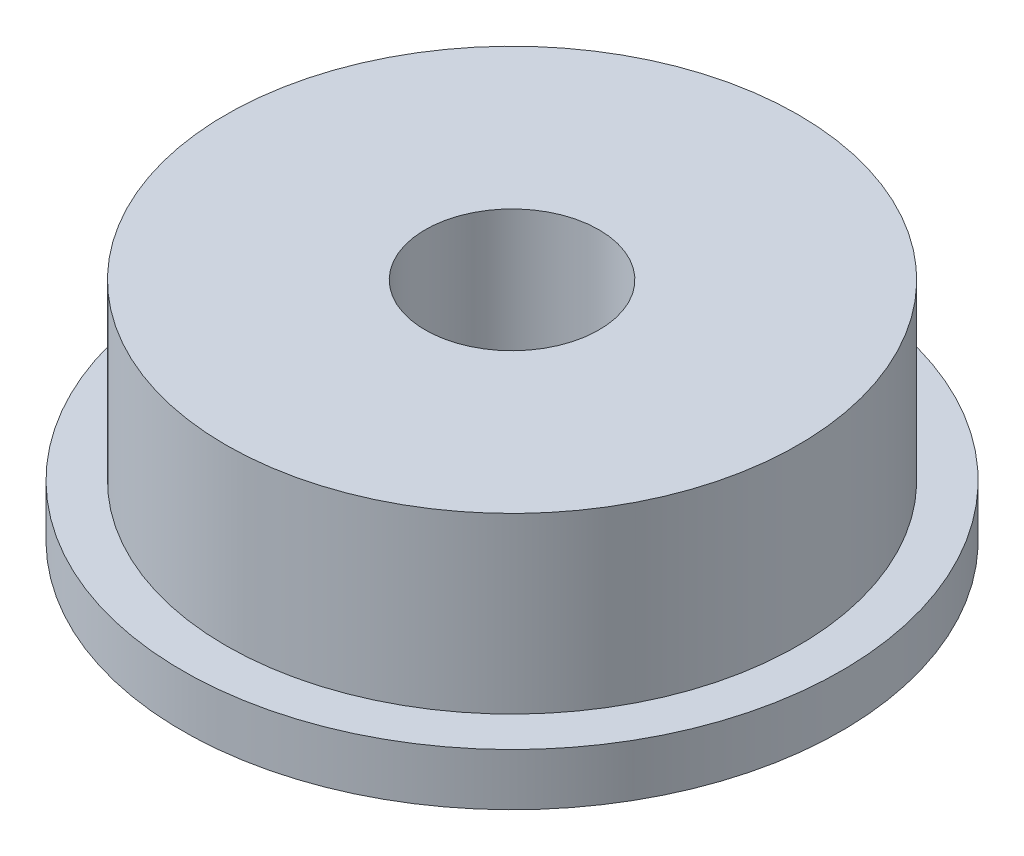
ISO-10303-21;
HEADER;
FILE_DESCRIPTION(('STEP AP214'),'2;1');
FILE_NAME('part.step','',(''),(''),'','','');
FILE_SCHEMA(('AUTOMOTIVE_DESIGN { 1 0 10303 214 1 1 1 1 }'));
ENDSEC;
DATA;
#1=APPLICATION_CONTEXT('core data for automotive mechanical design processes');
#2=APPLICATION_PROTOCOL_DEFINITION('international standard','automotive_design',2000,#1);
#3=PRODUCT_CONTEXT('',#1,'mechanical');
#4=PRODUCT('Part','Part','',(#3));
#5=PRODUCT_RELATED_PRODUCT_CATEGORY('part','',(#4));
#6=PRODUCT_DEFINITION_FORMATION('','',#4);
#7=PRODUCT_DEFINITION_CONTEXT('part definition',#1,'design');
#8=PRODUCT_DEFINITION('design','',#6,#7);
#9=PRODUCT_DEFINITION_SHAPE('','',#8);
#10=(LENGTH_UNIT() NAMED_UNIT(*) SI_UNIT(.MILLI.,.METRE.));
#11=(NAMED_UNIT(*) PLANE_ANGLE_UNIT() SI_UNIT($,.RADIAN.));
#12=(NAMED_UNIT(*) SI_UNIT($,.STERADIAN.) SOLID_ANGLE_UNIT());
#13=UNCERTAINTY_MEASURE_WITH_UNIT(LENGTH_MEASURE(1.E-05),#10,'distance_accuracy_value','');
#14=(GEOMETRIC_REPRESENTATION_CONTEXT(3) GLOBAL_UNCERTAINTY_ASSIGNED_CONTEXT((#13)) GLOBAL_UNIT_ASSIGNED_CONTEXT((#10,
#11,#12)) REPRESENTATION_CONTEXT('',''));
#15=CARTESIAN_POINT('',(0.,0.,0.));
#16=DIRECTION('',(0.,0.,1.));
#17=DIRECTION('',(1.,0.,0.));
#18=AXIS2_PLACEMENT_3D('',#15,#16,#17);
#19=CARTESIAN_POINT('',(5.69,0.,0.));
#20=DIRECTION('',(0.,-1.,0.));
#21=DIRECTION('',(0.,0.,-1.));
#22=AXIS2_PLACEMENT_3D('',#19,#20,#21);
#23=PLANE('',#22);
#24=CARTESIAN_POINT('',(0.,0.,0.));
#25=DIRECTION('',(0.,-1.,0.));
#26=DIRECTION('',(0.,0.,-1.));
#27=AXIS2_PLACEMENT_3D('',#24,#25,#26);
#28=CIRCLE('',#27,5.69);
#29=CARTESIAN_POINT('',(0.,0.,-5.69));
#30=VERTEX_POINT('',#29);
#31=EDGE_CURVE('E53',#30,#30,#28,.T.);
#32=ORIENTED_EDGE('',*,*,#31,.T.);
#33=EDGE_LOOP('',(#32));
#34=FACE_BOUND('',#33,.T.);
#35=CARTESIAN_POINT('',(0.,0.,0.));
#36=DIRECTION('',(0.,-1.,0.));
#37=DIRECTION('',(0.,0.,-1.));
#38=AXIS2_PLACEMENT_3D('',#35,#36,#37);
#39=CIRCLE('',#38,1.5);
#40=CARTESIAN_POINT('',(0.,0.,-1.5));
#41=VERTEX_POINT('',#40);
#42=EDGE_CURVE('E10',#41,#41,#39,.T.);
#43=ORIENTED_EDGE('',*,*,#42,.F.);
#44=EDGE_LOOP('',(#43));
#45=FACE_BOUND('',#44,.T.);
#46=ADVANCED_FACE('F31',(#34,#45),#23,.T.);
#47=CARTESIAN_POINT('',(0.,0.,0.));
#48=DIRECTION('',(0.,-1.,0.));
#49=DIRECTION('',(0.,0.,-1.));
#50=AXIS2_PLACEMENT_3D('',#47,#48,#49);
#51=CYLINDRICAL_SURFACE('',#50,1.5);
#52=ORIENTED_EDGE('',*,*,#42,.T.);
#53=EDGE_LOOP('',(#52));
#54=FACE_BOUND('',#53,.T.);
#55=CARTESIAN_POINT('',(0.,3.9,0.));
#56=DIRECTION('',(0.,-1.,0.));
#57=DIRECTION('',(0.,0.,-1.));
#58=AXIS2_PLACEMENT_3D('',#55,#56,#57);
#59=CIRCLE('',#58,1.5);
#60=CARTESIAN_POINT('',(0.,3.9,-1.5));
#61=VERTEX_POINT('',#60);
#62=EDGE_CURVE('E37',#61,#61,#59,.T.);
#63=ORIENTED_EDGE('',*,*,#62,.F.);
#64=EDGE_LOOP('',(#63));
#65=FACE_BOUND('',#64,.T.);
#66=ADVANCED_FACE('F71',(#54,#65),#51,.F.);
#67=CARTESIAN_POINT('',(1.5,3.9,0.));
#68=DIRECTION('',(0.,1.,0.));
#69=DIRECTION('',(0.,0.,1.));
#70=AXIS2_PLACEMENT_3D('',#67,#68,#69);
#71=PLANE('',#70);
#72=ORIENTED_EDGE('',*,*,#62,.T.);
#73=EDGE_LOOP('',(#72));
#74=FACE_BOUND('',#73,.T.);
#75=CARTESIAN_POINT('',(0.,3.9,0.));
#76=DIRECTION('',(0.,-1.,0.));
#77=DIRECTION('',(0.,0.,-1.));
#78=AXIS2_PLACEMENT_3D('',#75,#76,#77);
#79=CIRCLE('',#78,4.94);
#80=CARTESIAN_POINT('',(0.,3.9,-4.94));
#81=VERTEX_POINT('',#80);
#82=EDGE_CURVE('E41',#81,#81,#79,.T.);
#83=ORIENTED_EDGE('',*,*,#82,.F.);
#84=EDGE_LOOP('',(#83));
#85=FACE_BOUND('',#84,.T.);
#86=ADVANCED_FACE('F75',(#74,#85),#71,.T.);
#87=CARTESIAN_POINT('',(0.,0.,0.));
#88=DIRECTION('',(0.,-1.,0.));
#89=DIRECTION('',(0.,0.,-1.));
#90=AXIS2_PLACEMENT_3D('',#87,#88,#89);
#91=CYLINDRICAL_SURFACE('',#90,4.94);
#92=ORIENTED_EDGE('',*,*,#82,.T.);
#93=EDGE_LOOP('',(#92));
#94=FACE_BOUND('',#93,.T.);
#95=CARTESIAN_POINT('',(0.,0.9,0.));
#96=DIRECTION('',(0.,-1.,0.));
#97=DIRECTION('',(0.,0.,-1.));
#98=AXIS2_PLACEMENT_3D('',#95,#96,#97);
#99=CIRCLE('',#98,4.94);
#100=CARTESIAN_POINT('',(0.,0.9,-4.94));
#101=VERTEX_POINT('',#100);
#102=EDGE_CURVE('E45',#101,#101,#99,.T.);
#103=ORIENTED_EDGE('',*,*,#102,.F.);
#104=EDGE_LOOP('',(#103));
#105=FACE_BOUND('',#104,.T.);
#106=ADVANCED_FACE('F67',(#94,#105),#91,.T.);
#107=CARTESIAN_POINT('',(4.94,0.9,0.));
#108=DIRECTION('',(0.,1.,0.));
#109=DIRECTION('',(0.,0.,1.));
#110=AXIS2_PLACEMENT_3D('',#107,#108,#109);
#111=PLANE('',#110);
#112=ORIENTED_EDGE('',*,*,#102,.T.);
#113=EDGE_LOOP('',(#112));
#114=FACE_BOUND('',#113,.T.);
#115=CARTESIAN_POINT('',(0.,0.9,0.));
#116=DIRECTION('',(0.,-1.,0.));
#117=DIRECTION('',(0.,0.,-1.));
#118=AXIS2_PLACEMENT_3D('',#115,#116,#117);
#119=CIRCLE('',#118,5.69);
#120=CARTESIAN_POINT('',(0.,0.9,-5.69));
#121=VERTEX_POINT('',#120);
#122=EDGE_CURVE('E50',#121,#121,#119,.T.);
#123=ORIENTED_EDGE('',*,*,#122,.F.);
#124=EDGE_LOOP('',(#123));
#125=FACE_BOUND('',#124,.T.);
#126=ADVANCED_FACE('F61',(#114,#125),#111,.T.);
#127=CARTESIAN_POINT('',(0.,0.,0.));
#128=DIRECTION('',(0.,-1.,0.));
#129=DIRECTION('',(0.,0.,-1.));
#130=AXIS2_PLACEMENT_3D('',#127,#128,#129);
#131=CYLINDRICAL_SURFACE('',#130,5.69);
#132=ORIENTED_EDGE('',*,*,#122,.T.);
#133=EDGE_LOOP('',(#132));
#134=FACE_BOUND('',#133,.T.);
#135=ORIENTED_EDGE('',*,*,#31,.F.);
#136=EDGE_LOOP('',(#135));
#137=FACE_BOUND('',#136,.T.);
#138=ADVANCED_FACE('F59',(#134,#137),#131,.T.);
#139=CLOSED_SHELL('',(#46,#66,#86,#106,#126,#138));
#140=MANIFOLD_SOLID_BREP('B2',#139);
#141=ADVANCED_BREP_SHAPE_REPRESENTATION('',(#18,#140),#14);
#142=SHAPE_DEFINITION_REPRESENTATION(#9,#141);
ENDSEC;
END-ISO-10303-21;
